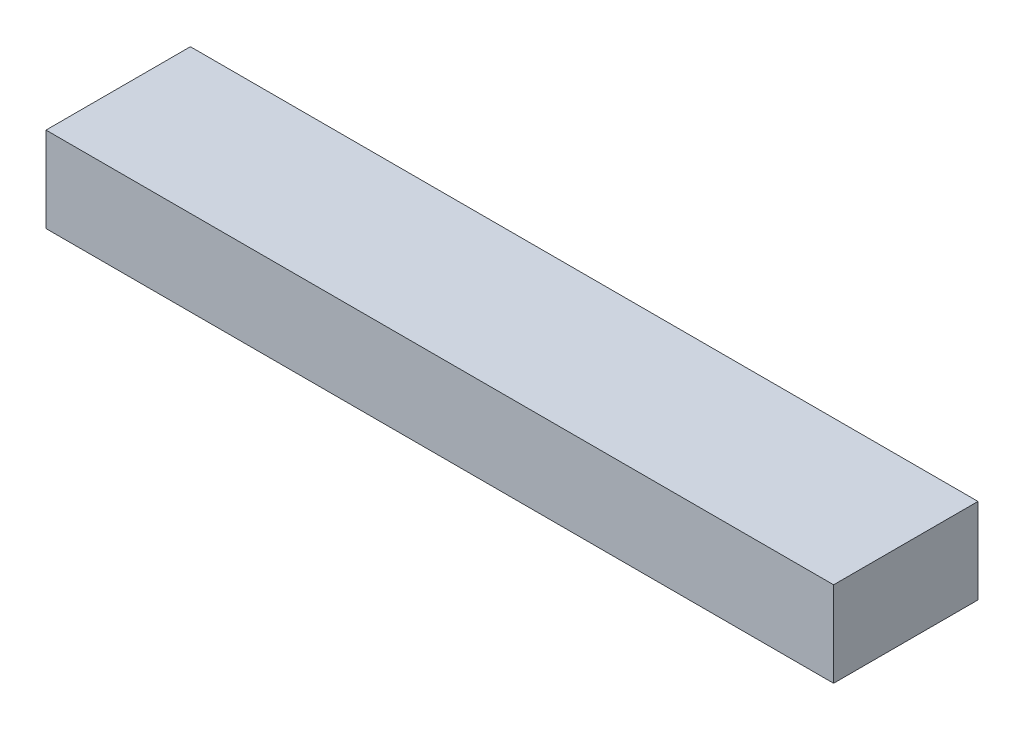
ISO-10303-21;
HEADER;
FILE_DESCRIPTION(('STEP AP214'),'2;1');
FILE_NAME('part.step','',(''),(''),'','','');
FILE_SCHEMA(('AUTOMOTIVE_DESIGN { 1 0 10303 214 1 1 1 1 }'));
ENDSEC;
DATA;
#1=APPLICATION_CONTEXT('core data for automotive mechanical design processes');
#2=APPLICATION_PROTOCOL_DEFINITION('international standard','automotive_design',2000,#1);
#3=PRODUCT_CONTEXT('',#1,'mechanical');
#4=PRODUCT('Part','Part','',(#3));
#5=PRODUCT_RELATED_PRODUCT_CATEGORY('part','',(#4));
#6=PRODUCT_DEFINITION_FORMATION('','',#4);
#7=PRODUCT_DEFINITION_CONTEXT('part definition',#1,'design');
#8=PRODUCT_DEFINITION('design','',#6,#7);
#9=PRODUCT_DEFINITION_SHAPE('','',#8);
#10=(LENGTH_UNIT() NAMED_UNIT(*) SI_UNIT(.MILLI.,.METRE.));
#11=(NAMED_UNIT(*) PLANE_ANGLE_UNIT() SI_UNIT($,.RADIAN.));
#12=(NAMED_UNIT(*) SI_UNIT($,.STERADIAN.) SOLID_ANGLE_UNIT());
#13=UNCERTAINTY_MEASURE_WITH_UNIT(LENGTH_MEASURE(1.E-05),#10,'distance_accuracy_value','');
#14=(GEOMETRIC_REPRESENTATION_CONTEXT(3) GLOBAL_UNCERTAINTY_ASSIGNED_CONTEXT((#13)) GLOBAL_UNIT_ASSIGNED_CONTEXT((#10,
#11,#12)) REPRESENTATION_CONTEXT('',''));
#15=CARTESIAN_POINT('',(0.,0.,0.));
#16=DIRECTION('',(0.,0.,1.));
#17=DIRECTION('',(1.,0.,0.));
#18=AXIS2_PLACEMENT_3D('',#15,#16,#17);
#19=CARTESIAN_POINT('',(-58.0824742268041,13.,-33.1134020618557));
#20=DIRECTION('',(1.,0.,0.));
#21=DIRECTION('',(0.,0.,-1.));
#22=AXIS2_PLACEMENT_3D('',#19,#20,#21);
#23=PLANE('',#22);
#24=DIRECTION('',(0.,0.,1.));
#25=VECTOR('',#24,1.);
#26=CARTESIAN_POINT('',(-58.0824742268041,0.,-33.1134020618557));
#27=LINE('',#26,#25);
#28=CARTESIAN_POINT('',(-58.0824742268041,0.,-33.1134020618557));
#29=VERTEX_POINT('',#28);
#30=CARTESIAN_POINT('',(-58.0824742268041,0.,-11.1134020618557));
#31=VERTEX_POINT('',#30);
#32=EDGE_CURVE('E98',#29,#31,#27,.T.);
#33=ORIENTED_EDGE('',*,*,#32,.T.);
#34=DIRECTION('',(0.,-1.,0.));
#35=VECTOR('',#34,1.);
#36=CARTESIAN_POINT('',(-58.0824742268041,13.,-11.1134020618557));
#37=LINE('',#36,#35);
#38=CARTESIAN_POINT('',(-58.0824742268041,13.,-11.1134020618557));
#39=VERTEX_POINT('',#38);
#40=EDGE_CURVE('E11',#39,#31,#37,.T.);
#41=ORIENTED_EDGE('',*,*,#40,.F.);
#42=DIRECTION('',(0.,0.,1.));
#43=VECTOR('',#42,1.);
#44=CARTESIAN_POINT('',(-58.0824742268041,13.,-33.1134020618557));
#45=LINE('',#44,#43);
#46=CARTESIAN_POINT('',(-58.0824742268041,13.,-33.1134020618557));
#47=VERTEX_POINT('',#46);
#48=EDGE_CURVE('E84',#47,#39,#45,.T.);
#49=ORIENTED_EDGE('',*,*,#48,.F.);
#50=DIRECTION('',(0.,-1.,0.));
#51=VECTOR('',#50,1.);
#52=CARTESIAN_POINT('',(-58.0824742268041,13.,-33.1134020618557));
#53=LINE('',#52,#51);
#54=EDGE_CURVE('E51',#47,#29,#53,.T.);
#55=ORIENTED_EDGE('',*,*,#54,.T.);
#56=EDGE_LOOP('',(#33,#41,#49,#55));
#57=FACE_BOUND('',#56,.T.);
#58=ADVANCED_FACE('F35',(#57),#23,.F.);
#59=CARTESIAN_POINT('',(-58.0824742268041,13.,-11.1134020618557));
#60=DIRECTION('',(0.,0.,-1.));
#61=DIRECTION('',(-1.,0.,0.));
#62=AXIS2_PLACEMENT_3D('',#59,#60,#61);
#63=PLANE('',#62);
#64=DIRECTION('',(1.,0.,0.));
#65=VECTOR('',#64,1.);
#66=CARTESIAN_POINT('',(-58.0824742268041,0.,-11.1134020618557));
#67=LINE('',#66,#65);
#68=CARTESIAN_POINT('',(61.9175257731959,0.,-11.1134020618557));
#69=VERTEX_POINT('',#68);
#70=EDGE_CURVE('E89',#31,#69,#67,.T.);
#71=ORIENTED_EDGE('',*,*,#70,.T.);
#72=DIRECTION('',(0.,-1.,0.));
#73=VECTOR('',#72,1.);
#74=CARTESIAN_POINT('',(61.9175257731959,13.,-11.1134020618557));
#75=LINE('',#74,#73);
#76=CARTESIAN_POINT('',(61.9175257731959,13.,-11.1134020618557));
#77=VERTEX_POINT('',#76);
#78=EDGE_CURVE('E43',#77,#69,#75,.T.);
#79=ORIENTED_EDGE('',*,*,#78,.F.);
#80=DIRECTION('',(1.,0.,0.));
#81=VECTOR('',#80,1.);
#82=CARTESIAN_POINT('',(-58.0824742268041,13.,-11.1134020618557));
#83=LINE('',#82,#81);
#84=EDGE_CURVE('E76',#39,#77,#83,.T.);
#85=ORIENTED_EDGE('',*,*,#84,.F.);
#86=ORIENTED_EDGE('',*,*,#40,.T.);
#87=EDGE_LOOP('',(#71,#79,#85,#86));
#88=FACE_BOUND('',#87,.T.);
#89=ADVANCED_FACE('F88',(#88),#63,.F.);
#90=CARTESIAN_POINT('',(61.9175257731959,13.,-33.1134020618557));
#91=DIRECTION('',(1.,0.,0.));
#92=DIRECTION('',(0.,0.,-1.));
#93=AXIS2_PLACEMENT_3D('',#90,#91,#92);
#94=PLANE('',#93);
#95=DIRECTION('',(0.,0.,1.));
#96=VECTOR('',#95,1.);
#97=CARTESIAN_POINT('',(61.9175257731959,0.,-33.1134020618557));
#98=LINE('',#97,#96);
#99=CARTESIAN_POINT('',(61.9175257731959,0.,-33.1134020618557));
#100=VERTEX_POINT('',#99);
#101=EDGE_CURVE('E101',#100,#69,#98,.T.);
#102=ORIENTED_EDGE('',*,*,#101,.F.);
#103=DIRECTION('',(0.,-1.,0.));
#104=VECTOR('',#103,1.);
#105=CARTESIAN_POINT('',(61.9175257731959,13.,-33.1134020618557));
#106=LINE('',#105,#104);
#107=CARTESIAN_POINT('',(61.9175257731959,13.,-33.1134020618557));
#108=VERTEX_POINT('',#107);
#109=EDGE_CURVE('E65',#108,#100,#106,.T.);
#110=ORIENTED_EDGE('',*,*,#109,.F.);
#111=DIRECTION('',(0.,0.,1.));
#112=VECTOR('',#111,1.);
#113=CARTESIAN_POINT('',(61.9175257731959,13.,-33.1134020618557));
#114=LINE('',#113,#112);
#115=EDGE_CURVE('E83',#108,#77,#114,.T.);
#116=ORIENTED_EDGE('',*,*,#115,.T.);
#117=ORIENTED_EDGE('',*,*,#78,.T.);
#118=EDGE_LOOP('',(#102,#110,#116,#117));
#119=FACE_BOUND('',#118,.T.);
#120=ADVANCED_FACE('F92',(#119),#94,.T.);
#121=CARTESIAN_POINT('',(-58.0824742268041,13.,-33.1134020618557));
#122=DIRECTION('',(0.,0.,-1.));
#123=DIRECTION('',(-1.,0.,0.));
#124=AXIS2_PLACEMENT_3D('',#121,#122,#123);
#125=PLANE('',#124);
#126=DIRECTION('',(1.,0.,0.));
#127=VECTOR('',#126,1.);
#128=CARTESIAN_POINT('',(-58.0824742268041,0.,-33.1134020618557));
#129=LINE('',#128,#127);
#130=EDGE_CURVE('E103',#29,#100,#129,.T.);
#131=ORIENTED_EDGE('',*,*,#130,.F.);
#132=ORIENTED_EDGE('',*,*,#54,.F.);
#133=DIRECTION('',(1.,0.,0.));
#134=VECTOR('',#133,1.);
#135=CARTESIAN_POINT('',(-58.0824742268041,13.,-33.1134020618557));
#136=LINE('',#135,#134);
#137=EDGE_CURVE('E93',#47,#108,#136,.T.);
#138=ORIENTED_EDGE('',*,*,#137,.T.);
#139=ORIENTED_EDGE('',*,*,#109,.T.);
#140=EDGE_LOOP('',(#131,#132,#138,#139));
#141=FACE_BOUND('',#140,.T.);
#142=ADVANCED_FACE('F109',(#141),#125,.T.);
#143=CARTESIAN_POINT('',(0.,13.,0.));
#144=DIRECTION('',(0.,1.,0.));
#145=DIRECTION('',(0.,0.,1.));
#146=AXIS2_PLACEMENT_3D('',#143,#144,#145);
#147=PLANE('',#146);
#148=ORIENTED_EDGE('',*,*,#48,.T.);
#149=ORIENTED_EDGE('',*,*,#84,.T.);
#150=ORIENTED_EDGE('',*,*,#115,.F.);
#151=ORIENTED_EDGE('',*,*,#137,.F.);
#152=EDGE_LOOP('',(#148,#149,#150,#151));
#153=FACE_BOUND('',#152,.T.);
#154=ADVANCED_FACE('F80',(#153),#147,.T.);
#155=CARTESIAN_POINT('',(0.,0.,0.));
#156=DIRECTION('',(0.,1.,0.));
#157=DIRECTION('',(0.,0.,1.));
#158=AXIS2_PLACEMENT_3D('',#155,#156,#157);
#159=PLANE('',#158);
#160=ORIENTED_EDGE('',*,*,#32,.F.);
#161=ORIENTED_EDGE('',*,*,#130,.T.);
#162=ORIENTED_EDGE('',*,*,#101,.T.);
#163=ORIENTED_EDGE('',*,*,#70,.F.);
#164=EDGE_LOOP('',(#160,#161,#162,#163));
#165=FACE_BOUND('',#164,.T.);
#166=ADVANCED_FACE('F108',(#165),#159,.F.);
#167=CLOSED_SHELL('',(#58,#89,#120,#142,#154,#166));
#168=MANIFOLD_SOLID_BREP('B2',#167);
#169=ADVANCED_BREP_SHAPE_REPRESENTATION('',(#18,#168),#14);
#170=SHAPE_DEFINITION_REPRESENTATION(#9,#169);
ENDSEC;
END-ISO-10303-21;
